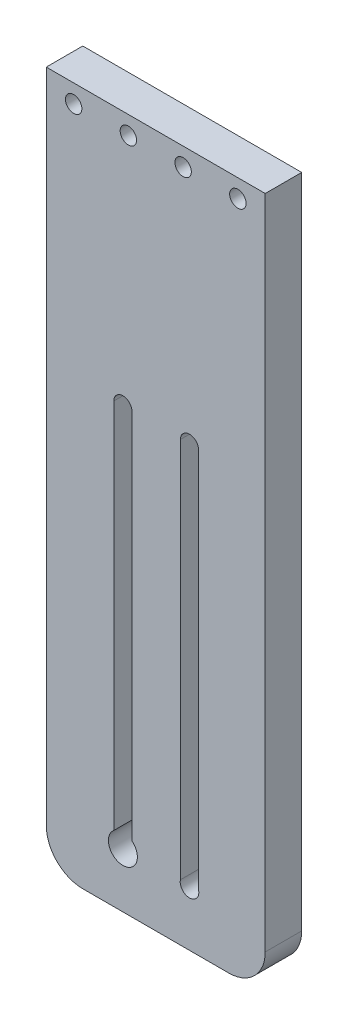
ISO-10303-21;
HEADER;
FILE_DESCRIPTION(('STEP AP214'),'2;1');
FILE_NAME('part.step','',(''),(''),'','','');
FILE_SCHEMA(('AUTOMOTIVE_DESIGN { 1 0 10303 214 1 1 1 1 }'));
ENDSEC;
DATA;
#1=APPLICATION_CONTEXT('core data for automotive mechanical design processes');
#2=APPLICATION_PROTOCOL_DEFINITION('international standard','automotive_design',2000,#1);
#3=PRODUCT_CONTEXT('',#1,'mechanical');
#4=PRODUCT('Part','Part','',(#3));
#5=PRODUCT_RELATED_PRODUCT_CATEGORY('part','',(#4));
#6=PRODUCT_DEFINITION_FORMATION('','',#4);
#7=PRODUCT_DEFINITION_CONTEXT('part definition',#1,'design');
#8=PRODUCT_DEFINITION('design','',#6,#7);
#9=PRODUCT_DEFINITION_SHAPE('','',#8);
#10=(LENGTH_UNIT() NAMED_UNIT(*) SI_UNIT(.MILLI.,.METRE.));
#11=(NAMED_UNIT(*) PLANE_ANGLE_UNIT() SI_UNIT($,.RADIAN.));
#12=(NAMED_UNIT(*) SI_UNIT($,.STERADIAN.) SOLID_ANGLE_UNIT());
#13=UNCERTAINTY_MEASURE_WITH_UNIT(LENGTH_MEASURE(1.E-05),#10,'distance_accuracy_value','');
#14=(GEOMETRIC_REPRESENTATION_CONTEXT(3) GLOBAL_UNCERTAINTY_ASSIGNED_CONTEXT((#13)) GLOBAL_UNIT_ASSIGNED_CONTEXT((#10,
#11,#12)) REPRESENTATION_CONTEXT('',''));
#15=CARTESIAN_POINT('',(0.,0.,0.));
#16=DIRECTION('',(0.,0.,1.));
#17=DIRECTION('',(1.,0.,0.));
#18=AXIS2_PLACEMENT_3D('',#15,#16,#17);
#19=CARTESIAN_POINT('',(0.,0.,10.));
#20=DIRECTION('',(0.,0.,1.));
#21=DIRECTION('',(1.,0.,0.));
#22=AXIS2_PLACEMENT_3D('',#19,#20,#21);
#23=PLANE('',#22);
#24=DIRECTION('',(0.,-1.,0.));
#25=VECTOR('',#24,1.);
#26=CARTESIAN_POINT('',(18.5,-175.,10.));
#27=LINE('',#26,#25);
#28=CARTESIAN_POINT('',(18.5,-70.,10.));
#29=VERTEX_POINT('',#28);
#30=CARTESIAN_POINT('',(18.5,-171.91763458323,10.));
#31=VERTEX_POINT('',#30);
#32=EDGE_CURVE('E235',#29,#31,#27,.T.);
#33=ORIENTED_EDGE('',*,*,#32,.F.);
#34=CARTESIAN_POINT('',(21.,-70.,10.));
#35=DIRECTION('',(0.,0.,1.));
#36=DIRECTION('',(1.,0.,0.));
#37=AXIS2_PLACEMENT_3D('',#34,#35,#36);
#38=CIRCLE('',#37,2.5);
#39=CARTESIAN_POINT('',(23.5,-70.,10.));
#40=VERTEX_POINT('',#39);
#41=EDGE_CURVE('E237',#40,#29,#38,.T.);
#42=ORIENTED_EDGE('',*,*,#41,.F.);
#43=DIRECTION('',(0.,1.,0.));
#44=VECTOR('',#43,1.);
#45=CARTESIAN_POINT('',(23.5,-175.,10.));
#46=LINE('',#45,#44);
#47=CARTESIAN_POINT('',(23.5,-171.91763458323,10.));
#48=VERTEX_POINT('',#47);
#49=EDGE_CURVE('E216',#48,#40,#46,.T.);
#50=ORIENTED_EDGE('',*,*,#49,.F.);
#51=CARTESIAN_POINT('',(21.,-175.,10.));
#52=DIRECTION('',(0.,0.,1.));
#53=DIRECTION('',(1.,0.,0.));
#54=AXIS2_PLACEMENT_3D('',#51,#52,#53);
#55=CIRCLE('',#54,3.96874999999999);
#56=EDGE_CURVE('E267',#31,#48,#55,.T.);
#57=ORIENTED_EDGE('',*,*,#56,.F.);
#58=EDGE_LOOP('',(#33,#42,#50,#57));
#59=FACE_BOUND('',#58,.T.);
#60=DIRECTION('',(0.,-1.,0.));
#61=VECTOR('',#60,1.);
#62=CARTESIAN_POINT('',(36.75,-175.,10.));
#63=LINE('',#62,#61);
#64=CARTESIAN_POINT('',(36.75,-70.,10.));
#65=VERTEX_POINT('',#64);
#66=CARTESIAN_POINT('',(36.75,-174.483979370567,10.));
#67=VERTEX_POINT('',#66);
#68=EDGE_CURVE('E253',#65,#67,#63,.T.);
#69=ORIENTED_EDGE('',*,*,#68,.F.);
#70=CARTESIAN_POINT('',(39.25,-70.,10.));
#71=DIRECTION('',(0.,0.,1.));
#72=DIRECTION('',(1.,0.,0.));
#73=AXIS2_PLACEMENT_3D('',#70,#71,#72);
#74=CIRCLE('',#73,2.5);
#75=CARTESIAN_POINT('',(41.75,-70.,10.));
#76=VERTEX_POINT('',#75);
#77=EDGE_CURVE('E261',#76,#65,#74,.T.);
#78=ORIENTED_EDGE('',*,*,#77,.F.);
#79=DIRECTION('',(0.,1.,0.));
#80=VECTOR('',#79,1.);
#81=CARTESIAN_POINT('',(41.75,-175.,10.));
#82=LINE('',#81,#80);
#83=CARTESIAN_POINT('',(41.75,-174.483979370567,10.));
#84=VERTEX_POINT('',#83);
#85=EDGE_CURVE('E247',#84,#76,#82,.T.);
#86=ORIENTED_EDGE('',*,*,#85,.F.);
#87=CARTESIAN_POINT('',(39.25,-175.,10.));
#88=DIRECTION('',(0.,0.,1.));
#89=DIRECTION('',(1.,0.,0.));
#90=AXIS2_PLACEMENT_3D('',#87,#88,#89);
#91=CIRCLE('',#90,2.55269999999998);
#92=EDGE_CURVE('E273',#67,#84,#91,.T.);
#93=ORIENTED_EDGE('',*,*,#92,.F.);
#94=EDGE_LOOP('',(#69,#78,#86,#93));
#95=FACE_BOUND('',#94,.T.);
#96=CARTESIAN_POINT('',(52.5,-5.,10.));
#97=DIRECTION('',(0.,0.,1.));
#98=DIRECTION('',(1.,0.,0.));
#99=AXIS2_PLACEMENT_3D('',#96,#97,#98);
#100=CIRCLE('',#99,2.25);
#101=CARTESIAN_POINT('',(54.75,-5.,10.));
#102=VERTEX_POINT('',#101);
#103=EDGE_CURVE('E284',#102,#102,#100,.F.);
#104=ORIENTED_EDGE('',*,*,#103,.T.);
#105=EDGE_LOOP('',(#104));
#106=FACE_BOUND('',#105,.T.);
#107=CARTESIAN_POINT('',(37.5,-5.,10.));
#108=DIRECTION('',(0.,0.,1.));
#109=DIRECTION('',(1.,0.,0.));
#110=AXIS2_PLACEMENT_3D('',#107,#108,#109);
#111=CIRCLE('',#110,2.25);
#112=CARTESIAN_POINT('',(39.75,-5.,10.));
#113=VERTEX_POINT('',#112);
#114=EDGE_CURVE('E296',#113,#113,#111,.F.);
#115=ORIENTED_EDGE('',*,*,#114,.T.);
#116=EDGE_LOOP('',(#115));
#117=FACE_BOUND('',#116,.T.);
#118=DIRECTION('',(0.,-1.,0.));
#119=VECTOR('',#118,1.);
#120=CARTESIAN_POINT('',(0.,0.,10.));
#121=LINE('',#120,#119);
#122=CARTESIAN_POINT('',(0.,0.,10.));
#123=VERTEX_POINT('',#122);
#124=CARTESIAN_POINT('',(0.,-180.,10.));
#125=VERTEX_POINT('',#124);
#126=EDGE_CURVE('E328',#123,#125,#121,.T.);
#127=ORIENTED_EDGE('',*,*,#126,.T.);
#128=CARTESIAN_POINT('',(10.,-180.,10.));
#129=DIRECTION('',(0.,0.,1.));
#130=DIRECTION('',(1.,0.,0.));
#131=AXIS2_PLACEMENT_3D('',#128,#129,#130);
#132=CIRCLE('',#131,10.);
#133=CARTESIAN_POINT('',(10.,-190.,10.));
#134=VERTEX_POINT('',#133);
#135=EDGE_CURVE('E377',#125,#134,#132,.T.);
#136=ORIENTED_EDGE('',*,*,#135,.T.);
#137=DIRECTION('',(1.,0.,0.));
#138=VECTOR('',#137,1.);
#139=CARTESIAN_POINT('',(0.,-190.,10.));
#140=LINE('',#139,#138);
#141=CARTESIAN_POINT('',(50.,-190.,10.));
#142=VERTEX_POINT('',#141);
#143=EDGE_CURVE('E331',#134,#142,#140,.T.);
#144=ORIENTED_EDGE('',*,*,#143,.T.);
#145=CARTESIAN_POINT('',(50.,-180.,10.));
#146=DIRECTION('',(0.,0.,1.));
#147=DIRECTION('',(1.,0.,0.));
#148=AXIS2_PLACEMENT_3D('',#145,#146,#147);
#149=CIRCLE('',#148,10.);
#150=CARTESIAN_POINT('',(60.,-180.,10.));
#151=VERTEX_POINT('',#150);
#152=EDGE_CURVE('E375',#142,#151,#149,.T.);
#153=ORIENTED_EDGE('',*,*,#152,.T.);
#154=DIRECTION('',(0.,1.,0.));
#155=VECTOR('',#154,1.);
#156=CARTESIAN_POINT('',(60.,-150.,10.));
#157=LINE('',#156,#155);
#158=CARTESIAN_POINT('',(60.,0.,10.));
#159=VERTEX_POINT('',#158);
#160=EDGE_CURVE('E335',#151,#159,#157,.T.);
#161=ORIENTED_EDGE('',*,*,#160,.T.);
#162=DIRECTION('',(-1.,0.,0.));
#163=VECTOR('',#162,1.);
#164=CARTESIAN_POINT('',(0.,0.,10.));
#165=LINE('',#164,#163);
#166=EDGE_CURVE('E337',#159,#123,#165,.T.);
#167=ORIENTED_EDGE('',*,*,#166,.T.);
#168=EDGE_LOOP('',(#127,#136,#144,#153,#161,#167));
#169=FACE_BOUND('',#168,.T.);
#170=CARTESIAN_POINT('',(7.5,-5.,10.));
#171=DIRECTION('',(0.,0.,1.));
#172=DIRECTION('',(1.,0.,0.));
#173=AXIS2_PLACEMENT_3D('',#170,#171,#172);
#174=CIRCLE('',#173,2.25);
#175=CARTESIAN_POINT('',(9.75,-5.,10.));
#176=VERTEX_POINT('',#175);
#177=EDGE_CURVE('E320',#176,#176,#174,.F.);
#178=ORIENTED_EDGE('',*,*,#177,.T.);
#179=EDGE_LOOP('',(#178));
#180=FACE_BOUND('',#179,.T.);
#181=CARTESIAN_POINT('',(22.5,-5.,10.));
#182=DIRECTION('',(0.,0.,1.));
#183=DIRECTION('',(1.,0.,0.));
#184=AXIS2_PLACEMENT_3D('',#181,#182,#183);
#185=CIRCLE('',#184,2.25);
#186=CARTESIAN_POINT('',(24.75,-5.,10.));
#187=VERTEX_POINT('',#186);
#188=EDGE_CURVE('E308',#187,#187,#185,.F.);
#189=ORIENTED_EDGE('',*,*,#188,.T.);
#190=EDGE_LOOP('',(#189));
#191=FACE_BOUND('',#190,.T.);
#192=ADVANCED_FACE('F37',(#59,#95,#106,#117,#169,#180,#191),#23,.T.);
#193=CARTESIAN_POINT('',(0.,0.,10.));
#194=DIRECTION('',(1.,0.,0.));
#195=DIRECTION('',(0.,1.,0.));
#196=AXIS2_PLACEMENT_3D('',#193,#194,#195);
#197=PLANE('',#196);
#198=DIRECTION('',(0.,-1.,0.));
#199=VECTOR('',#198,1.);
#200=CARTESIAN_POINT('',(0.,0.,0.));
#201=LINE('',#200,#199);
#202=CARTESIAN_POINT('',(0.,0.,0.));
#203=VERTEX_POINT('',#202);
#204=CARTESIAN_POINT('',(0.,-180.,0.));
#205=VERTEX_POINT('',#204);
#206=EDGE_CURVE('E323',#203,#205,#201,.T.);
#207=ORIENTED_EDGE('',*,*,#206,.T.);
#208=DIRECTION('',(0.,0.,-1.));
#209=VECTOR('',#208,1.);
#210=CARTESIAN_POINT('',(0.,-180.,10.));
#211=LINE('',#210,#209);
#212=EDGE_CURVE('E373',#205,#125,#211,.F.);
#213=ORIENTED_EDGE('',*,*,#212,.T.);
#214=ORIENTED_EDGE('',*,*,#126,.F.);
#215=DIRECTION('',(0.,0.,-1.));
#216=VECTOR('',#215,1.);
#217=CARTESIAN_POINT('',(0.,0.,10.));
#218=LINE('',#217,#216);
#219=EDGE_CURVE('E339',#123,#203,#218,.T.);
#220=ORIENTED_EDGE('',*,*,#219,.T.);
#221=EDGE_LOOP('',(#207,#213,#214,#220));
#222=FACE_BOUND('',#221,.T.);
#223=ADVANCED_FACE('F526',(#222),#197,.F.);
#224=CARTESIAN_POINT('',(0.,-190.,10.));
#225=DIRECTION('',(0.,1.,0.));
#226=DIRECTION('',(0.,0.,1.));
#227=AXIS2_PLACEMENT_3D('',#224,#225,#226);
#228=PLANE('',#227);
#229=ORIENTED_EDGE('',*,*,#143,.F.);
#230=DIRECTION('',(0.,0.,-1.));
#231=VECTOR('',#230,1.);
#232=CARTESIAN_POINT('',(10.,-190.,10.));
#233=LINE('',#232,#231);
#234=CARTESIAN_POINT('',(10.,-190.,0.));
#235=VERTEX_POINT('',#234);
#236=EDGE_CURVE('E366',#134,#235,#233,.T.);
#237=ORIENTED_EDGE('',*,*,#236,.T.);
#238=DIRECTION('',(1.,0.,0.));
#239=VECTOR('',#238,1.);
#240=CARTESIAN_POINT('',(0.,-190.,0.));
#241=LINE('',#240,#239);
#242=CARTESIAN_POINT('',(50.,-190.,0.));
#243=VERTEX_POINT('',#242);
#244=EDGE_CURVE('E342',#235,#243,#241,.T.);
#245=ORIENTED_EDGE('',*,*,#244,.T.);
#246=DIRECTION('',(0.,0.,-1.));
#247=VECTOR('',#246,1.);
#248=CARTESIAN_POINT('',(50.,-190.,10.));
#249=LINE('',#248,#247);
#250=EDGE_CURVE('E364',#243,#142,#249,.F.);
#251=ORIENTED_EDGE('',*,*,#250,.T.);
#252=EDGE_LOOP('',(#229,#237,#245,#251));
#253=FACE_BOUND('',#252,.T.);
#254=ADVANCED_FACE('F531',(#253),#228,.F.);
#255=CARTESIAN_POINT('',(60.,0.,10.));
#256=DIRECTION('',(-1.,0.,0.));
#257=DIRECTION('',(0.,-1.,0.));
#258=AXIS2_PLACEMENT_3D('',#255,#256,#257);
#259=PLANE('',#258);
#260=ORIENTED_EDGE('',*,*,#160,.F.);
#261=DIRECTION('',(0.,0.,-1.));
#262=VECTOR('',#261,1.);
#263=CARTESIAN_POINT('',(60.,-180.,10.));
#264=LINE('',#263,#262);
#265=CARTESIAN_POINT('',(60.,-180.,0.));
#266=VERTEX_POINT('',#265);
#267=EDGE_CURVE('E379',#151,#266,#264,.T.);
#268=ORIENTED_EDGE('',*,*,#267,.T.);
#269=DIRECTION('',(0.,1.,0.));
#270=VECTOR('',#269,1.);
#271=CARTESIAN_POINT('',(60.,0.,0.));
#272=LINE('',#271,#270);
#273=CARTESIAN_POINT('',(60.,0.,0.));
#274=VERTEX_POINT('',#273);
#275=EDGE_CURVE('E345',#266,#274,#272,.T.);
#276=ORIENTED_EDGE('',*,*,#275,.T.);
#277=DIRECTION('',(0.,0.,-1.));
#278=VECTOR('',#277,1.);
#279=CARTESIAN_POINT('',(60.,0.,10.));
#280=LINE('',#279,#278);
#281=EDGE_CURVE('E350',#159,#274,#280,.T.);
#282=ORIENTED_EDGE('',*,*,#281,.F.);
#283=EDGE_LOOP('',(#260,#268,#276,#282));
#284=FACE_BOUND('',#283,.T.);
#285=ADVANCED_FACE('F521',(#284),#259,.F.);
#286=CARTESIAN_POINT('',(0.,0.,10.));
#287=DIRECTION('',(0.,-1.,0.));
#288=DIRECTION('',(0.,0.,-1.));
#289=AXIS2_PLACEMENT_3D('',#286,#287,#288);
#290=PLANE('',#289);
#291=DIRECTION('',(-1.,0.,0.));
#292=VECTOR('',#291,1.);
#293=CARTESIAN_POINT('',(0.,0.,0.));
#294=LINE('',#293,#292);
#295=EDGE_CURVE('E332',#274,#203,#294,.T.);
#296=ORIENTED_EDGE('',*,*,#295,.T.);
#297=ORIENTED_EDGE('',*,*,#219,.F.);
#298=ORIENTED_EDGE('',*,*,#166,.F.);
#299=ORIENTED_EDGE('',*,*,#281,.T.);
#300=EDGE_LOOP('',(#296,#297,#298,#299));
#301=FACE_BOUND('',#300,.T.);
#302=ADVANCED_FACE('F512',(#301),#290,.F.);
#303=CARTESIAN_POINT('',(0.,0.,0.));
#304=DIRECTION('',(0.,0.,1.));
#305=DIRECTION('',(1.,0.,0.));
#306=AXIS2_PLACEMENT_3D('',#303,#304,#305);
#307=PLANE('',#306);
#308=DIRECTION('',(0.,1.,0.));
#309=VECTOR('',#308,1.);
#310=CARTESIAN_POINT('',(19.9,-15.,0.));
#311=LINE('',#310,#309);
#312=CARTESIAN_POINT('',(19.9,-50.5278640450004,0.));
#313=VERTEX_POINT('',#312);
#314=CARTESIAN_POINT('',(19.9,-19.,0.));
#315=VERTEX_POINT('',#314);
#316=EDGE_CURVE('E452',#313,#315,#311,.T.);
#317=ORIENTED_EDGE('',*,*,#316,.F.);
#318=CARTESIAN_POINT('',(15.9,-50.5278640450004,0.));
#319=DIRECTION('',(0.,0.,1.));
#320=DIRECTION('',(1.,0.,0.));
#321=AXIS2_PLACEMENT_3D('',#318,#319,#320);
#322=CIRCLE('',#321,4.);
#323=CARTESIAN_POINT('',(18.5666666666667,-53.5092880150001,0.));
#324=VERTEX_POINT('',#323);
#325=EDGE_CURVE('E407',#313,#324,#322,.F.);
#326=ORIENTED_EDGE('',*,*,#325,.T.);
#327=CARTESIAN_POINT('',(19.9,-55.,0.));
#328=DIRECTION('',(0.,0.,-1.));
#329=DIRECTION('',(-1.,0.,0.));
#330=AXIS2_PLACEMENT_3D('',#327,#328,#329);
#331=CIRCLE('',#330,2.);
#332=CARTESIAN_POINT('',(21.3907119849999,-56.3333333333333,0.));
#333=VERTEX_POINT('',#332);
#334=EDGE_CURVE('E455',#333,#324,#331,.T.);
#335=ORIENTED_EDGE('',*,*,#334,.F.);
#336=CARTESIAN_POINT('',(24.3721359549996,-59.,0.));
#337=DIRECTION('',(0.,0.,1.));
#338=DIRECTION('',(1.,0.,0.));
#339=AXIS2_PLACEMENT_3D('',#336,#337,#338);
#340=CIRCLE('',#339,4.);
#341=CARTESIAN_POINT('',(24.3721359549996,-55.,0.));
#342=VERTEX_POINT('',#341);
#343=EDGE_CURVE('E402',#333,#342,#340,.F.);
#344=ORIENTED_EDGE('',*,*,#343,.T.);
#345=DIRECTION('',(-1.,0.,0.));
#346=VECTOR('',#345,1.);
#347=CARTESIAN_POINT('',(40.1,-55.,0.));
#348=LINE('',#347,#346);
#349=CARTESIAN_POINT('',(35.6278640450004,-55.,0.));
#350=VERTEX_POINT('',#349);
#351=EDGE_CURVE('E240',#350,#342,#348,.T.);
#352=ORIENTED_EDGE('',*,*,#351,.F.);
#353=CARTESIAN_POINT('',(35.6278640450004,-59.,0.));
#354=DIRECTION('',(0.,0.,1.));
#355=DIRECTION('',(1.,0.,0.));
#356=AXIS2_PLACEMENT_3D('',#353,#354,#355);
#357=CIRCLE('',#356,4.);
#358=CARTESIAN_POINT('',(38.6092880150001,-56.3333333333333,0.));
#359=VERTEX_POINT('',#358);
#360=EDGE_CURVE('E52',#350,#359,#357,.F.);
#361=ORIENTED_EDGE('',*,*,#360,.T.);
#362=CARTESIAN_POINT('',(40.1,-55.,0.));
#363=DIRECTION('',(0.,0.,-1.));
#364=DIRECTION('',(-1.,0.,0.));
#365=AXIS2_PLACEMENT_3D('',#362,#363,#364);
#366=CIRCLE('',#365,2.);
#367=CARTESIAN_POINT('',(41.4333333333333,-53.5092880150001,0.));
#368=VERTEX_POINT('',#367);
#369=EDGE_CURVE('E448',#368,#359,#366,.T.);
#370=ORIENTED_EDGE('',*,*,#369,.F.);
#371=CARTESIAN_POINT('',(44.1,-50.5278640450004,0.));
#372=DIRECTION('',(0.,0.,1.));
#373=DIRECTION('',(1.,0.,0.));
#374=AXIS2_PLACEMENT_3D('',#371,#372,#373);
#375=CIRCLE('',#374,4.);
#376=CARTESIAN_POINT('',(40.1,-50.5278640450004,0.));
#377=VERTEX_POINT('',#376);
#378=EDGE_CURVE('E405',#368,#377,#375,.F.);
#379=ORIENTED_EDGE('',*,*,#378,.T.);
#380=DIRECTION('',(0.,-1.,0.));
#381=VECTOR('',#380,1.);
#382=CARTESIAN_POINT('',(40.1,-15.,0.));
#383=LINE('',#382,#381);
#384=CARTESIAN_POINT('',(40.1,-19.,0.));
#385=VERTEX_POINT('',#384);
#386=EDGE_CURVE('E470',#385,#377,#383,.T.);
#387=ORIENTED_EDGE('',*,*,#386,.F.);
#388=CARTESIAN_POINT('',(36.1,-19.,0.));
#389=DIRECTION('',(0.,0.,1.));
#390=DIRECTION('',(1.,0.,0.));
#391=AXIS2_PLACEMENT_3D('',#388,#389,#390);
#392=CIRCLE('',#391,4.);
#393=CARTESIAN_POINT('',(36.1,-15.,0.));
#394=VERTEX_POINT('',#393);
#395=EDGE_CURVE('E424',#385,#394,#392,.T.);
#396=ORIENTED_EDGE('',*,*,#395,.T.);
#397=DIRECTION('',(1.,0.,0.));
#398=VECTOR('',#397,1.);
#399=CARTESIAN_POINT('',(40.1,-15.,0.));
#400=LINE('',#399,#398);
#401=CARTESIAN_POINT('',(23.9,-15.,0.));
#402=VERTEX_POINT('',#401);
#403=EDGE_CURVE('E468',#402,#394,#400,.T.);
#404=ORIENTED_EDGE('',*,*,#403,.F.);
#405=CARTESIAN_POINT('',(23.9,-19.,0.));
#406=DIRECTION('',(0.,0.,1.));
#407=DIRECTION('',(1.,0.,0.));
#408=AXIS2_PLACEMENT_3D('',#405,#406,#407);
#409=CIRCLE('',#408,4.);
#410=EDGE_CURVE('E422',#402,#315,#409,.T.);
#411=ORIENTED_EDGE('',*,*,#410,.T.);
#412=EDGE_LOOP('',(#317,#326,#335,#344,#352,#361,#370,#379,#387,#396,#404,#411));
#413=FACE_BOUND('',#412,.T.);
#414=CARTESIAN_POINT('',(21.,-70.,0.));
#415=DIRECTION('',(0.,0.,1.));
#416=DIRECTION('',(1.,0.,0.));
#417=AXIS2_PLACEMENT_3D('',#414,#415,#416);
#418=CIRCLE('',#417,2.5);
#419=CARTESIAN_POINT('',(23.5,-70.,0.));
#420=VERTEX_POINT('',#419);
#421=CARTESIAN_POINT('',(18.5,-70.,0.));
#422=VERTEX_POINT('',#421);
#423=EDGE_CURVE('E224',#420,#422,#418,.T.);
#424=ORIENTED_EDGE('',*,*,#423,.T.);
#425=DIRECTION('',(0.,-1.,0.));
#426=VECTOR('',#425,1.);
#427=CARTESIAN_POINT('',(18.5,-175.,0.));
#428=LINE('',#427,#426);
#429=CARTESIAN_POINT('',(18.5,-171.91763458323,0.));
#430=VERTEX_POINT('',#429);
#431=EDGE_CURVE('E221',#422,#430,#428,.T.);
#432=ORIENTED_EDGE('',*,*,#431,.T.);
#433=CARTESIAN_POINT('',(21.,-175.,0.));
#434=DIRECTION('',(0.,0.,1.));
#435=DIRECTION('',(1.,0.,0.));
#436=AXIS2_PLACEMENT_3D('',#433,#434,#435);
#437=CIRCLE('',#436,3.96874999999999);
#438=CARTESIAN_POINT('',(23.5,-171.91763458323,0.));
#439=VERTEX_POINT('',#438);
#440=EDGE_CURVE('E234',#430,#439,#437,.T.);
#441=ORIENTED_EDGE('',*,*,#440,.T.);
#442=DIRECTION('',(0.,1.,0.));
#443=VECTOR('',#442,1.);
#444=CARTESIAN_POINT('',(23.5,-175.,0.));
#445=LINE('',#444,#443);
#446=EDGE_CURVE('E213',#439,#420,#445,.T.);
#447=ORIENTED_EDGE('',*,*,#446,.T.);
#448=EDGE_LOOP('',(#424,#432,#441,#447));
#449=FACE_BOUND('',#448,.T.);
#450=CARTESIAN_POINT('',(39.25,-70.,0.));
#451=DIRECTION('',(0.,0.,1.));
#452=DIRECTION('',(1.,0.,0.));
#453=AXIS2_PLACEMENT_3D('',#450,#451,#452);
#454=CIRCLE('',#453,2.5);
#455=CARTESIAN_POINT('',(41.75,-70.,0.));
#456=VERTEX_POINT('',#455);
#457=CARTESIAN_POINT('',(36.75,-70.,0.));
#458=VERTEX_POINT('',#457);
#459=EDGE_CURVE('E252',#456,#458,#454,.T.);
#460=ORIENTED_EDGE('',*,*,#459,.T.);
#461=DIRECTION('',(0.,-1.,0.));
#462=VECTOR('',#461,1.);
#463=CARTESIAN_POINT('',(36.75,-175.,0.));
#464=LINE('',#463,#462);
#465=CARTESIAN_POINT('',(36.75,-174.483979370567,0.));
#466=VERTEX_POINT('',#465);
#467=EDGE_CURVE('E256',#458,#466,#464,.T.);
#468=ORIENTED_EDGE('',*,*,#467,.T.);
#469=CARTESIAN_POINT('',(39.25,-175.,0.));
#470=DIRECTION('',(0.,0.,1.));
#471=DIRECTION('',(1.,0.,0.));
#472=AXIS2_PLACEMENT_3D('',#469,#470,#471);
#473=CIRCLE('',#472,2.5527);
#474=CARTESIAN_POINT('',(41.75,-174.483979370567,0.));
#475=VERTEX_POINT('',#474);
#476=EDGE_CURVE('E276',#466,#475,#473,.T.);
#477=ORIENTED_EDGE('',*,*,#476,.T.);
#478=DIRECTION('',(0.,1.,0.));
#479=VECTOR('',#478,1.);
#480=CARTESIAN_POINT('',(41.75,-175.,0.));
#481=LINE('',#480,#479);
#482=EDGE_CURVE('E249',#475,#456,#481,.T.);
#483=ORIENTED_EDGE('',*,*,#482,.T.);
#484=EDGE_LOOP('',(#460,#468,#477,#483));
#485=FACE_BOUND('',#484,.T.);
#486=CARTESIAN_POINT('',(52.5,-5.,0.));
#487=DIRECTION('',(0.,0.,-1.));
#488=DIRECTION('',(-1.,0.,0.));
#489=AXIS2_PLACEMENT_3D('',#486,#487,#488);
#490=CIRCLE('',#489,4.);
#491=CARTESIAN_POINT('',(48.5,-5.,0.));
#492=VERTEX_POINT('',#491);
#493=EDGE_CURVE('E279',#492,#492,#490,.T.);
#494=ORIENTED_EDGE('',*,*,#493,.F.);
#495=EDGE_LOOP('',(#494));
#496=FACE_BOUND('',#495,.T.);
#497=CARTESIAN_POINT('',(37.5,-5.,0.));
#498=DIRECTION('',(0.,0.,-1.));
#499=DIRECTION('',(-1.,0.,0.));
#500=AXIS2_PLACEMENT_3D('',#497,#498,#499);
#501=CIRCLE('',#500,4.);
#502=CARTESIAN_POINT('',(33.5,-5.,0.));
#503=VERTEX_POINT('',#502);
#504=EDGE_CURVE('E287',#503,#503,#501,.T.);
#505=ORIENTED_EDGE('',*,*,#504,.F.);
#506=EDGE_LOOP('',(#505));
#507=FACE_BOUND('',#506,.T.);
#508=CARTESIAN_POINT('',(22.5,-5.,0.));
#509=DIRECTION('',(0.,0.,-1.));
#510=DIRECTION('',(-1.,0.,0.));
#511=AXIS2_PLACEMENT_3D('',#508,#509,#510);
#512=CIRCLE('',#511,4.);
#513=CARTESIAN_POINT('',(18.5,-5.,0.));
#514=VERTEX_POINT('',#513);
#515=EDGE_CURVE('E299',#514,#514,#512,.T.);
#516=ORIENTED_EDGE('',*,*,#515,.F.);
#517=EDGE_LOOP('',(#516));
#518=FACE_BOUND('',#517,.T.);
#519=CARTESIAN_POINT('',(7.5,-5.,0.));
#520=DIRECTION('',(0.,0.,-1.));
#521=DIRECTION('',(-1.,0.,0.));
#522=AXIS2_PLACEMENT_3D('',#519,#520,#521);
#523=CIRCLE('',#522,4.);
#524=CARTESIAN_POINT('',(3.5,-5.,0.));
#525=VERTEX_POINT('',#524);
#526=EDGE_CURVE('E311',#525,#525,#523,.T.);
#527=ORIENTED_EDGE('',*,*,#526,.F.);
#528=EDGE_LOOP('',(#527));
#529=FACE_BOUND('',#528,.T.);
#530=ORIENTED_EDGE('',*,*,#244,.F.);
#531=CARTESIAN_POINT('',(10.,-180.,0.));
#532=DIRECTION('',(0.,0.,1.));
#533=DIRECTION('',(1.,0.,0.));
#534=AXIS2_PLACEMENT_3D('',#531,#532,#533);
#535=CIRCLE('',#534,10.);
#536=EDGE_CURVE('E371',#235,#205,#535,.F.);
#537=ORIENTED_EDGE('',*,*,#536,.T.);
#538=ORIENTED_EDGE('',*,*,#206,.F.);
#539=ORIENTED_EDGE('',*,*,#295,.F.);
#540=ORIENTED_EDGE('',*,*,#275,.F.);
#541=CARTESIAN_POINT('',(50.,-180.,0.));
#542=DIRECTION('',(0.,0.,1.));
#543=DIRECTION('',(1.,0.,0.));
#544=AXIS2_PLACEMENT_3D('',#541,#542,#543);
#545=CIRCLE('',#544,10.);
#546=EDGE_CURVE('E369',#266,#243,#545,.F.);
#547=ORIENTED_EDGE('',*,*,#546,.T.);
#548=EDGE_LOOP('',(#530,#537,#538,#539,#540,#547));
#549=FACE_BOUND('',#548,.T.);
#550=ADVANCED_FACE('F231',(#413,#449,#485,#496,#507,#518,#529,#549),#307,.F.);
#551=CARTESIAN_POINT('',(7.5,-5.,0.));
#552=DIRECTION('',(0.,0.,-1.));
#553=DIRECTION('',(-1.,0.,0.));
#554=AXIS2_PLACEMENT_3D('',#551,#552,#553);
#555=CYLINDRICAL_SURFACE('',#554,2.25);
#556=ORIENTED_EDGE('',*,*,#177,.F.);
#557=EDGE_LOOP('',(#556));
#558=FACE_BOUND('',#557,.T.);
#559=CARTESIAN_POINT('',(7.5,-5.,4.));
#560=DIRECTION('',(0.,0.,-1.));
#561=DIRECTION('',(-1.,0.,0.));
#562=AXIS2_PLACEMENT_3D('',#559,#560,#561);
#563=CIRCLE('',#562,2.25);
#564=CARTESIAN_POINT('',(5.25,-5.,4.));
#565=VERTEX_POINT('',#564);
#566=EDGE_CURVE('E316',#565,#565,#563,.T.);
#567=ORIENTED_EDGE('',*,*,#566,.T.);
#568=EDGE_LOOP('',(#567));
#569=FACE_BOUND('',#568,.T.);
#570=ADVANCED_FACE('F511',(#558,#569),#555,.F.);
#571=CARTESIAN_POINT('',(9.75,-5.,4.));
#572=DIRECTION('',(0.,0.,1.));
#573=DIRECTION('',(1.,0.,0.));
#574=AXIS2_PLACEMENT_3D('',#571,#572,#573);
#575=PLANE('',#574);
#576=ORIENTED_EDGE('',*,*,#566,.F.);
#577=EDGE_LOOP('',(#576));
#578=FACE_BOUND('',#577,.T.);
#579=CARTESIAN_POINT('',(7.5,-5.,4.));
#580=DIRECTION('',(0.,0.,-1.));
#581=DIRECTION('',(-1.,0.,0.));
#582=AXIS2_PLACEMENT_3D('',#579,#580,#581);
#583=CIRCLE('',#582,4.);
#584=CARTESIAN_POINT('',(3.5,-5.,4.));
#585=VERTEX_POINT('',#584);
#586=EDGE_CURVE('E319',#585,#585,#583,.T.);
#587=ORIENTED_EDGE('',*,*,#586,.T.);
#588=EDGE_LOOP('',(#587));
#589=FACE_BOUND('',#588,.T.);
#590=ADVANCED_FACE('F518',(#578,#589),#575,.F.);
#591=CARTESIAN_POINT('',(7.5,-5.,0.));
#592=DIRECTION('',(0.,0.,-1.));
#593=DIRECTION('',(-1.,0.,0.));
#594=AXIS2_PLACEMENT_3D('',#591,#592,#593);
#595=CYLINDRICAL_SURFACE('',#594,4.);
#596=ORIENTED_EDGE('',*,*,#586,.F.);
#597=EDGE_LOOP('',(#596));
#598=FACE_BOUND('',#597,.T.);
#599=ORIENTED_EDGE('',*,*,#526,.T.);
#600=EDGE_LOOP('',(#599));
#601=FACE_BOUND('',#600,.T.);
#602=ADVANCED_FACE('F537',(#598,#601),#595,.F.);
#603=CARTESIAN_POINT('',(22.5,-5.,0.));
#604=DIRECTION('',(0.,0.,-1.));
#605=DIRECTION('',(-1.,0.,0.));
#606=AXIS2_PLACEMENT_3D('',#603,#604,#605);
#607=CYLINDRICAL_SURFACE('',#606,2.25);
#608=ORIENTED_EDGE('',*,*,#188,.F.);
#609=EDGE_LOOP('',(#608));
#610=FACE_BOUND('',#609,.T.);
#611=CARTESIAN_POINT('',(22.5,-5.,4.));
#612=DIRECTION('',(0.,0.,-1.));
#613=DIRECTION('',(-1.,0.,0.));
#614=AXIS2_PLACEMENT_3D('',#611,#612,#613);
#615=CIRCLE('',#614,2.25);
#616=CARTESIAN_POINT('',(20.25,-5.,4.));
#617=VERTEX_POINT('',#616);
#618=EDGE_CURVE('E304',#617,#617,#615,.T.);
#619=ORIENTED_EDGE('',*,*,#618,.T.);
#620=EDGE_LOOP('',(#619));
#621=FACE_BOUND('',#620,.T.);
#622=ADVANCED_FACE('F540',(#610,#621),#607,.F.);
#623=CARTESIAN_POINT('',(24.75,-5.,4.));
#624=DIRECTION('',(0.,0.,1.));
#625=DIRECTION('',(1.,0.,0.));
#626=AXIS2_PLACEMENT_3D('',#623,#624,#625);
#627=PLANE('',#626);
#628=ORIENTED_EDGE('',*,*,#618,.F.);
#629=EDGE_LOOP('',(#628));
#630=FACE_BOUND('',#629,.T.);
#631=CARTESIAN_POINT('',(22.5,-5.,4.));
#632=DIRECTION('',(0.,0.,-1.));
#633=DIRECTION('',(-1.,0.,0.));
#634=AXIS2_PLACEMENT_3D('',#631,#632,#633);
#635=CIRCLE('',#634,4.);
#636=CARTESIAN_POINT('',(18.5,-5.,4.));
#637=VERTEX_POINT('',#636);
#638=EDGE_CURVE('E307',#637,#637,#635,.T.);
#639=ORIENTED_EDGE('',*,*,#638,.T.);
#640=EDGE_LOOP('',(#639));
#641=FACE_BOUND('',#640,.T.);
#642=ADVANCED_FACE('F549',(#630,#641),#627,.F.);
#643=CARTESIAN_POINT('',(22.5,-5.,0.));
#644=DIRECTION('',(0.,0.,-1.));
#645=DIRECTION('',(-1.,0.,0.));
#646=AXIS2_PLACEMENT_3D('',#643,#644,#645);
#647=CYLINDRICAL_SURFACE('',#646,4.);
#648=ORIENTED_EDGE('',*,*,#638,.F.);
#649=EDGE_LOOP('',(#648));
#650=FACE_BOUND('',#649,.T.);
#651=ORIENTED_EDGE('',*,*,#515,.T.);
#652=EDGE_LOOP('',(#651));
#653=FACE_BOUND('',#652,.T.);
#654=ADVANCED_FACE('F545',(#650,#653),#647,.F.);
#655=CARTESIAN_POINT('',(37.5,-5.,0.));
#656=DIRECTION('',(0.,0.,-1.));
#657=DIRECTION('',(-1.,0.,0.));
#658=AXIS2_PLACEMENT_3D('',#655,#656,#657);
#659=CYLINDRICAL_SURFACE('',#658,2.25);
#660=ORIENTED_EDGE('',*,*,#114,.F.);
#661=EDGE_LOOP('',(#660));
#662=FACE_BOUND('',#661,.T.);
#663=CARTESIAN_POINT('',(37.5,-5.,4.));
#664=DIRECTION('',(0.,0.,-1.));
#665=DIRECTION('',(-1.,0.,0.));
#666=AXIS2_PLACEMENT_3D('',#663,#664,#665);
#667=CIRCLE('',#666,2.25);
#668=CARTESIAN_POINT('',(35.25,-5.,4.));
#669=VERTEX_POINT('',#668);
#670=EDGE_CURVE('E292',#669,#669,#667,.T.);
#671=ORIENTED_EDGE('',*,*,#670,.T.);
#672=EDGE_LOOP('',(#671));
#673=FACE_BOUND('',#672,.T.);
#674=ADVANCED_FACE('F548',(#662,#673),#659,.F.);
#675=CARTESIAN_POINT('',(39.75,-5.,4.));
#676=DIRECTION('',(0.,0.,1.));
#677=DIRECTION('',(1.,0.,0.));
#678=AXIS2_PLACEMENT_3D('',#675,#676,#677);
#679=PLANE('',#678);
#680=ORIENTED_EDGE('',*,*,#670,.F.);
#681=EDGE_LOOP('',(#680));
#682=FACE_BOUND('',#681,.T.);
#683=CARTESIAN_POINT('',(37.5,-5.,4.));
#684=DIRECTION('',(0.,0.,-1.));
#685=DIRECTION('',(-1.,0.,0.));
#686=AXIS2_PLACEMENT_3D('',#683,#684,#685);
#687=CIRCLE('',#686,4.);
#688=CARTESIAN_POINT('',(33.5,-5.,4.));
#689=VERTEX_POINT('',#688);
#690=EDGE_CURVE('E295',#689,#689,#687,.T.);
#691=ORIENTED_EDGE('',*,*,#690,.T.);
#692=EDGE_LOOP('',(#691));
#693=FACE_BOUND('',#692,.T.);
#694=ADVANCED_FACE('F561',(#682,#693),#679,.F.);
#695=CARTESIAN_POINT('',(37.5,-5.,0.));
#696=DIRECTION('',(0.,0.,-1.));
#697=DIRECTION('',(-1.,0.,0.));
#698=AXIS2_PLACEMENT_3D('',#695,#696,#697);
#699=CYLINDRICAL_SURFACE('',#698,4.);
#700=ORIENTED_EDGE('',*,*,#690,.F.);
#701=EDGE_LOOP('',(#700));
#702=FACE_BOUND('',#701,.T.);
#703=ORIENTED_EDGE('',*,*,#504,.T.);
#704=EDGE_LOOP('',(#703));
#705=FACE_BOUND('',#704,.T.);
#706=ADVANCED_FACE('F557',(#702,#705),#699,.F.);
#707=CARTESIAN_POINT('',(52.5,-5.,0.));
#708=DIRECTION('',(0.,0.,-1.));
#709=DIRECTION('',(-1.,0.,0.));
#710=AXIS2_PLACEMENT_3D('',#707,#708,#709);
#711=CYLINDRICAL_SURFACE('',#710,2.25);
#712=ORIENTED_EDGE('',*,*,#103,.F.);
#713=EDGE_LOOP('',(#712));
#714=FACE_BOUND('',#713,.T.);
#715=CARTESIAN_POINT('',(52.5,-5.,4.));
#716=DIRECTION('',(0.,0.,-1.));
#717=DIRECTION('',(-1.,0.,0.));
#718=AXIS2_PLACEMENT_3D('',#715,#716,#717);
#719=CIRCLE('',#718,2.25);
#720=CARTESIAN_POINT('',(50.25,-5.,4.));
#721=VERTEX_POINT('',#720);
#722=EDGE_CURVE('E280',#721,#721,#719,.T.);
#723=ORIENTED_EDGE('',*,*,#722,.T.);
#724=EDGE_LOOP('',(#723));
#725=FACE_BOUND('',#724,.T.);
#726=ADVANCED_FACE('F560',(#714,#725),#711,.F.);
#727=CARTESIAN_POINT('',(54.75,-5.,4.));
#728=DIRECTION('',(0.,0.,1.));
#729=DIRECTION('',(1.,0.,0.));
#730=AXIS2_PLACEMENT_3D('',#727,#728,#729);
#731=PLANE('',#730);
#732=ORIENTED_EDGE('',*,*,#722,.F.);
#733=EDGE_LOOP('',(#732));
#734=FACE_BOUND('',#733,.T.);
#735=CARTESIAN_POINT('',(52.5,-5.,4.));
#736=DIRECTION('',(0.,0.,-1.));
#737=DIRECTION('',(-1.,0.,0.));
#738=AXIS2_PLACEMENT_3D('',#735,#736,#737);
#739=CIRCLE('',#738,4.);
#740=CARTESIAN_POINT('',(48.5,-5.,4.));
#741=VERTEX_POINT('',#740);
#742=EDGE_CURVE('E283',#741,#741,#739,.T.);
#743=ORIENTED_EDGE('',*,*,#742,.T.);
#744=EDGE_LOOP('',(#743));
#745=FACE_BOUND('',#744,.T.);
#746=ADVANCED_FACE('F573',(#734,#745),#731,.F.);
#747=CARTESIAN_POINT('',(52.5,-5.,0.));
#748=DIRECTION('',(0.,0.,-1.));
#749=DIRECTION('',(-1.,0.,0.));
#750=AXIS2_PLACEMENT_3D('',#747,#748,#749);
#751=CYLINDRICAL_SURFACE('',#750,4.);
#752=ORIENTED_EDGE('',*,*,#742,.F.);
#753=EDGE_LOOP('',(#752));
#754=FACE_BOUND('',#753,.T.);
#755=ORIENTED_EDGE('',*,*,#493,.T.);
#756=EDGE_LOOP('',(#755));
#757=FACE_BOUND('',#756,.T.);
#758=ADVANCED_FACE('F569',(#754,#757),#751,.F.);
#759=CARTESIAN_POINT('',(39.25,-175.,10.));
#760=DIRECTION('',(0.,0.,1.));
#761=DIRECTION('',(1.,0.,0.));
#762=AXIS2_PLACEMENT_3D('',#759,#760,#761);
#763=CYLINDRICAL_SURFACE('',#762,2.55269999999999);
#764=ORIENTED_EDGE('',*,*,#476,.F.);
#765=DIRECTION('',(0.,0.,1.));
#766=VECTOR('',#765,1.);
#767=CARTESIAN_POINT('',(36.75,-174.483979370567,10.));
#768=LINE('',#767,#766);
#769=EDGE_CURVE('E356',#466,#67,#768,.T.);
#770=ORIENTED_EDGE('',*,*,#769,.T.);
#771=ORIENTED_EDGE('',*,*,#92,.T.);
#772=DIRECTION('',(0.,0.,1.));
#773=VECTOR('',#772,1.);
#774=CARTESIAN_POINT('',(41.75,-174.483979370567,10.));
#775=LINE('',#774,#773);
#776=EDGE_CURVE('E353',#84,#475,#775,.F.);
#777=ORIENTED_EDGE('',*,*,#776,.T.);
#778=EDGE_LOOP('',(#764,#770,#771,#777));
#779=FACE_BOUND('',#778,.T.);
#780=ADVANCED_FACE('F572',(#779),#763,.F.);
#781=CARTESIAN_POINT('',(21.,-175.,10.));
#782=DIRECTION('',(0.,0.,1.));
#783=DIRECTION('',(1.,0.,0.));
#784=AXIS2_PLACEMENT_3D('',#781,#782,#783);
#785=CYLINDRICAL_SURFACE('',#784,3.96874999999999);
#786=ORIENTED_EDGE('',*,*,#440,.F.);
#787=DIRECTION('',(0.,0.,1.));
#788=VECTOR('',#787,1.);
#789=CARTESIAN_POINT('',(18.5,-171.91763458323,10.));
#790=LINE('',#789,#788);
#791=EDGE_CURVE('E361',#430,#31,#790,.T.);
#792=ORIENTED_EDGE('',*,*,#791,.T.);
#793=ORIENTED_EDGE('',*,*,#56,.T.);
#794=DIRECTION('',(0.,0.,1.));
#795=VECTOR('',#794,1.);
#796=CARTESIAN_POINT('',(23.5,-171.91763458323,10.));
#797=LINE('',#796,#795);
#798=EDGE_CURVE('E359',#48,#439,#797,.F.);
#799=ORIENTED_EDGE('',*,*,#798,.T.);
#800=EDGE_LOOP('',(#786,#792,#793,#799));
#801=FACE_BOUND('',#800,.T.);
#802=ADVANCED_FACE('F583',(#801),#785,.F.);
#803=CARTESIAN_POINT('',(36.75,-175.,0.));
#804=DIRECTION('',(-1.,0.,0.));
#805=DIRECTION('',(0.,0.,1.));
#806=AXIS2_PLACEMENT_3D('',#803,#804,#805);
#807=PLANE('',#806);
#808=ORIENTED_EDGE('',*,*,#467,.F.);
#809=DIRECTION('',(0.,0.,1.));
#810=VECTOR('',#809,1.);
#811=CARTESIAN_POINT('',(36.75,-70.,0.));
#812=LINE('',#811,#810);
#813=EDGE_CURVE('E265',#458,#65,#812,.T.);
#814=ORIENTED_EDGE('',*,*,#813,.T.);
#815=ORIENTED_EDGE('',*,*,#68,.T.);
#816=ORIENTED_EDGE('',*,*,#769,.F.);
#817=EDGE_LOOP('',(#808,#814,#815,#816));
#818=FACE_BOUND('',#817,.T.);
#819=ADVANCED_FACE('F587',(#818),#807,.F.);
#820=CARTESIAN_POINT('',(41.75,-175.,0.));
#821=DIRECTION('',(1.,0.,0.));
#822=DIRECTION('',(0.,0.,-1.));
#823=AXIS2_PLACEMENT_3D('',#820,#821,#822);
#824=PLANE('',#823);
#825=ORIENTED_EDGE('',*,*,#85,.T.);
#826=DIRECTION('',(0.,0.,1.));
#827=VECTOR('',#826,1.);
#828=CARTESIAN_POINT('',(41.75,-70.,0.));
#829=LINE('',#828,#827);
#830=EDGE_CURVE('E259',#456,#76,#829,.T.);
#831=ORIENTED_EDGE('',*,*,#830,.F.);
#832=ORIENTED_EDGE('',*,*,#482,.F.);
#833=ORIENTED_EDGE('',*,*,#776,.F.);
#834=EDGE_LOOP('',(#825,#831,#832,#833));
#835=FACE_BOUND('',#834,.T.);
#836=ADVANCED_FACE('F589',(#835),#824,.F.);
#837=CARTESIAN_POINT('',(39.25,-70.,0.));
#838=DIRECTION('',(0.,0.,1.));
#839=DIRECTION('',(1.,0.,0.));
#840=AXIS2_PLACEMENT_3D('',#837,#838,#839);
#841=CYLINDRICAL_SURFACE('',#840,2.5);
#842=ORIENTED_EDGE('',*,*,#77,.T.);
#843=ORIENTED_EDGE('',*,*,#813,.F.);
#844=ORIENTED_EDGE('',*,*,#459,.F.);
#845=ORIENTED_EDGE('',*,*,#830,.T.);
#846=EDGE_LOOP('',(#842,#843,#844,#845));
#847=FACE_BOUND('',#846,.T.);
#848=ADVANCED_FACE('F592',(#847),#841,.F.);
#849=CARTESIAN_POINT('',(18.5,-175.,0.));
#850=DIRECTION('',(-1.,0.,0.));
#851=DIRECTION('',(0.,0.,1.));
#852=AXIS2_PLACEMENT_3D('',#849,#850,#851);
#853=PLANE('',#852);
#854=ORIENTED_EDGE('',*,*,#431,.F.);
#855=DIRECTION('',(0.,0.,1.));
#856=VECTOR('',#855,1.);
#857=CARTESIAN_POINT('',(18.5,-70.,0.));
#858=LINE('',#857,#856);
#859=EDGE_CURVE('E220',#422,#29,#858,.T.);
#860=ORIENTED_EDGE('',*,*,#859,.T.);
#861=ORIENTED_EDGE('',*,*,#32,.T.);
#862=ORIENTED_EDGE('',*,*,#791,.F.);
#863=EDGE_LOOP('',(#854,#860,#861,#862));
#864=FACE_BOUND('',#863,.T.);
#865=ADVANCED_FACE('F596',(#864),#853,.F.);
#866=CARTESIAN_POINT('',(23.5,-175.,0.));
#867=DIRECTION('',(1.,0.,0.));
#868=DIRECTION('',(0.,0.,-1.));
#869=AXIS2_PLACEMENT_3D('',#866,#867,#868);
#870=PLANE('',#869);
#871=ORIENTED_EDGE('',*,*,#49,.T.);
#872=DIRECTION('',(0.,0.,1.));
#873=VECTOR('',#872,1.);
#874=CARTESIAN_POINT('',(23.5,-70.,0.));
#875=LINE('',#874,#873);
#876=EDGE_CURVE('E209',#420,#40,#875,.T.);
#877=ORIENTED_EDGE('',*,*,#876,.F.);
#878=ORIENTED_EDGE('',*,*,#446,.F.);
#879=ORIENTED_EDGE('',*,*,#798,.F.);
#880=EDGE_LOOP('',(#871,#877,#878,#879));
#881=FACE_BOUND('',#880,.T.);
#882=ADVANCED_FACE('F211',(#881),#870,.F.);
#883=CARTESIAN_POINT('',(21.,-70.,0.));
#884=DIRECTION('',(0.,0.,1.));
#885=DIRECTION('',(1.,0.,0.));
#886=AXIS2_PLACEMENT_3D('',#883,#884,#885);
#887=CYLINDRICAL_SURFACE('',#886,2.5);
#888=ORIENTED_EDGE('',*,*,#41,.T.);
#889=ORIENTED_EDGE('',*,*,#859,.F.);
#890=ORIENTED_EDGE('',*,*,#423,.F.);
#891=ORIENTED_EDGE('',*,*,#876,.T.);
#892=EDGE_LOOP('',(#888,#889,#890,#891));
#893=FACE_BOUND('',#892,.T.);
#894=ADVANCED_FACE('F225',(#893),#887,.F.);
#895=CARTESIAN_POINT('',(10.,-180.,10.));
#896=DIRECTION('',(0.,0.,-1.));
#897=DIRECTION('',(-1.,0.,0.));
#898=AXIS2_PLACEMENT_3D('',#895,#896,#897);
#899=CYLINDRICAL_SURFACE('',#898,10.);
#900=ORIENTED_EDGE('',*,*,#135,.F.);
#901=ORIENTED_EDGE('',*,*,#212,.F.);
#902=ORIENTED_EDGE('',*,*,#536,.F.);
#903=ORIENTED_EDGE('',*,*,#236,.F.);
#904=EDGE_LOOP('',(#900,#901,#902,#903));
#905=FACE_BOUND('',#904,.T.);
#906=ADVANCED_FACE('F605',(#905),#899,.T.);
#907=CARTESIAN_POINT('',(50.,-180.,10.));
#908=DIRECTION('',(0.,0.,-1.));
#909=DIRECTION('',(-1.,0.,0.));
#910=AXIS2_PLACEMENT_3D('',#907,#908,#909);
#911=CYLINDRICAL_SURFACE('',#910,10.);
#912=ORIENTED_EDGE('',*,*,#152,.F.);
#913=ORIENTED_EDGE('',*,*,#250,.F.);
#914=ORIENTED_EDGE('',*,*,#546,.F.);
#915=ORIENTED_EDGE('',*,*,#267,.F.);
#916=EDGE_LOOP('',(#912,#913,#914,#915));
#917=FACE_BOUND('',#916,.T.);
#918=ADVANCED_FACE('F611',(#917),#911,.T.);
#919=CARTESIAN_POINT('',(19.9,-15.,7.));
#920=DIRECTION('',(-1.,0.,0.));
#921=DIRECTION('',(0.,0.,1.));
#922=AXIS2_PLACEMENT_3D('',#919,#920,#921);
#923=PLANE('',#922);
#924=ORIENTED_EDGE('',*,*,#316,.T.);
#925=DIRECTION('',(0.,0.,-1.));
#926=VECTOR('',#925,1.);
#927=CARTESIAN_POINT('',(19.9,-19.,7.));
#928=LINE('',#927,#926);
#929=CARTESIAN_POINT('',(19.9,-19.,7.));
#930=VERTEX_POINT('',#929);
#931=EDGE_CURVE('E390',#315,#930,#928,.F.);
#932=ORIENTED_EDGE('',*,*,#931,.T.);
#933=DIRECTION('',(0.,1.,0.));
#934=VECTOR('',#933,1.);
#935=CARTESIAN_POINT('',(19.9,-15.,7.));
#936=LINE('',#935,#934);
#937=CARTESIAN_POINT('',(19.9,-50.5278640450004,7.));
#938=VERTEX_POINT('',#937);
#939=EDGE_CURVE('E459',#938,#930,#936,.T.);
#940=ORIENTED_EDGE('',*,*,#939,.F.);
#941=DIRECTION('',(0.,0.,-1.));
#942=VECTOR('',#941,1.);
#943=CARTESIAN_POINT('',(19.9,-50.5278640450004,7.));
#944=LINE('',#943,#942);
#945=EDGE_CURVE('E387',#938,#313,#944,.T.);
#946=ORIENTED_EDGE('',*,*,#945,.T.);
#947=EDGE_LOOP('',(#924,#932,#940,#946));
#948=FACE_BOUND('',#947,.T.);
#949=ADVANCED_FACE('F491',(#948),#923,.F.);
#950=CARTESIAN_POINT('',(40.1,-55.,7.));
#951=DIRECTION('',(0.,-1.,0.));
#952=DIRECTION('',(0.,0.,-1.));
#953=AXIS2_PLACEMENT_3D('',#950,#951,#952);
#954=PLANE('',#953);
#955=DIRECTION('',(-1.,0.,0.));
#956=VECTOR('',#955,1.);
#957=CARTESIAN_POINT('',(40.1,-55.,7.));
#958=LINE('',#957,#956);
#959=CARTESIAN_POINT('',(35.6278640450004,-55.,7.));
#960=VERTEX_POINT('',#959);
#961=CARTESIAN_POINT('',(24.3721359549996,-55.,7.));
#962=VERTEX_POINT('',#961);
#963=EDGE_CURVE('E245',#960,#962,#958,.T.);
#964=ORIENTED_EDGE('',*,*,#963,.F.);
#965=DIRECTION('',(0.,0.,-1.));
#966=VECTOR('',#965,1.);
#967=CARTESIAN_POINT('',(35.6278640450004,-55.,7.));
#968=LINE('',#967,#966);
#969=EDGE_CURVE('E419',#960,#350,#968,.T.);
#970=ORIENTED_EDGE('',*,*,#969,.T.);
#971=ORIENTED_EDGE('',*,*,#351,.T.);
#972=DIRECTION('',(0.,0.,-1.));
#973=VECTOR('',#972,1.);
#974=CARTESIAN_POINT('',(24.3721359549996,-55.,7.));
#975=LINE('',#974,#973);
#976=EDGE_CURVE('E416',#342,#962,#975,.F.);
#977=ORIENTED_EDGE('',*,*,#976,.T.);
#978=EDGE_LOOP('',(#964,#970,#971,#977));
#979=FACE_BOUND('',#978,.T.);
#980=ADVANCED_FACE('F441',(#979),#954,.F.);
#981=CARTESIAN_POINT('',(40.1,-15.,7.));
#982=DIRECTION('',(1.,0.,0.));
#983=DIRECTION('',(0.,1.,0.));
#984=AXIS2_PLACEMENT_3D('',#981,#982,#983);
#985=PLANE('',#984);
#986=DIRECTION('',(0.,-1.,0.));
#987=VECTOR('',#986,1.);
#988=CARTESIAN_POINT('',(40.1,-15.,7.));
#989=LINE('',#988,#987);
#990=CARTESIAN_POINT('',(40.1,-19.,7.));
#991=VERTEX_POINT('',#990);
#992=CARTESIAN_POINT('',(40.1,-50.5278640450004,7.));
#993=VERTEX_POINT('',#992);
#994=EDGE_CURVE('E444',#991,#993,#989,.T.);
#995=ORIENTED_EDGE('',*,*,#994,.F.);
#996=DIRECTION('',(0.,0.,-1.));
#997=VECTOR('',#996,1.);
#998=CARTESIAN_POINT('',(40.1,-19.,0.));
#999=LINE('',#998,#997);
#1000=EDGE_CURVE('E399',#991,#385,#999,.T.);
#1001=ORIENTED_EDGE('',*,*,#1000,.T.);
#1002=ORIENTED_EDGE('',*,*,#386,.T.);
#1003=DIRECTION('',(0.,0.,-1.));
#1004=VECTOR('',#1003,1.);
#1005=CARTESIAN_POINT('',(40.1,-50.5278640450004,7.));
#1006=LINE('',#1005,#1004);
#1007=EDGE_CURVE('E396',#377,#993,#1006,.F.);
#1008=ORIENTED_EDGE('',*,*,#1007,.T.);
#1009=EDGE_LOOP('',(#995,#1001,#1002,#1008));
#1010=FACE_BOUND('',#1009,.T.);
#1011=ADVANCED_FACE('F507',(#1010),#985,.F.);
#1012=CARTESIAN_POINT('',(40.1,-15.,7.));
#1013=DIRECTION('',(0.,1.,0.));
#1014=DIRECTION('',(0.,0.,1.));
#1015=AXIS2_PLACEMENT_3D('',#1012,#1013,#1014);
#1016=PLANE('',#1015);
#1017=DIRECTION('',(1.,0.,0.));
#1018=VECTOR('',#1017,1.);
#1019=CARTESIAN_POINT('',(40.1,-15.,7.));
#1020=LINE('',#1019,#1018);
#1021=CARTESIAN_POINT('',(23.9,-15.,7.));
#1022=VERTEX_POINT('',#1021);
#1023=CARTESIAN_POINT('',(36.1,-15.,7.));
#1024=VERTEX_POINT('',#1023);
#1025=EDGE_CURVE('E461',#1022,#1024,#1020,.T.);
#1026=ORIENTED_EDGE('',*,*,#1025,.F.);
#1027=DIRECTION('',(0.,0.,-1.));
#1028=VECTOR('',#1027,1.);
#1029=CARTESIAN_POINT('',(23.9,-15.,0.));
#1030=LINE('',#1029,#1028);
#1031=EDGE_CURVE('E384',#1022,#402,#1030,.T.);
#1032=ORIENTED_EDGE('',*,*,#1031,.T.);
#1033=ORIENTED_EDGE('',*,*,#403,.T.);
#1034=DIRECTION('',(0.,0.,-1.));
#1035=VECTOR('',#1034,1.);
#1036=CARTESIAN_POINT('',(36.1,-15.,7.));
#1037=LINE('',#1036,#1035);
#1038=EDGE_CURVE('E382',#394,#1024,#1037,.F.);
#1039=ORIENTED_EDGE('',*,*,#1038,.T.);
#1040=EDGE_LOOP('',(#1026,#1032,#1033,#1039));
#1041=FACE_BOUND('',#1040,.T.);
#1042=ADVANCED_FACE('F500',(#1041),#1016,.F.);
#1043=CARTESIAN_POINT('',(0.,0.,7.));
#1044=DIRECTION('',(0.,0.,-1.));
#1045=DIRECTION('',(-1.,0.,0.));
#1046=AXIS2_PLACEMENT_3D('',#1043,#1044,#1045);
#1047=PLANE('',#1046);
#1048=ORIENTED_EDGE('',*,*,#939,.T.);
#1049=CARTESIAN_POINT('',(23.9,-19.,7.));
#1050=DIRECTION('',(0.,0.,-1.));
#1051=DIRECTION('',(-1.,0.,0.));
#1052=AXIS2_PLACEMENT_3D('',#1049,#1050,#1051);
#1053=CIRCLE('',#1052,4.);
#1054=EDGE_CURVE('E394',#930,#1022,#1053,.T.);
#1055=ORIENTED_EDGE('',*,*,#1054,.T.);
#1056=ORIENTED_EDGE('',*,*,#1025,.T.);
#1057=CARTESIAN_POINT('',(36.1,-19.,7.));
#1058=DIRECTION('',(0.,0.,-1.));
#1059=DIRECTION('',(-1.,0.,0.));
#1060=AXIS2_PLACEMENT_3D('',#1057,#1058,#1059);
#1061=CIRCLE('',#1060,4.);
#1062=EDGE_CURVE('E392',#1024,#991,#1061,.T.);
#1063=ORIENTED_EDGE('',*,*,#1062,.T.);
#1064=ORIENTED_EDGE('',*,*,#994,.T.);
#1065=CARTESIAN_POINT('',(44.1,-50.5278640450004,7.));
#1066=DIRECTION('',(0.,0.,-1.));
#1067=DIRECTION('',(-1.,0.,0.));
#1068=AXIS2_PLACEMENT_3D('',#1065,#1066,#1067);
#1069=CIRCLE('',#1068,4.);
#1070=CARTESIAN_POINT('',(41.4333333333333,-53.5092880150001,7.));
#1071=VERTEX_POINT('',#1070);
#1072=EDGE_CURVE('E428',#993,#1071,#1069,.F.);
#1073=ORIENTED_EDGE('',*,*,#1072,.T.);
#1074=CARTESIAN_POINT('',(40.1,-55.,7.));
#1075=DIRECTION('',(0.,0.,-1.));
#1076=DIRECTION('',(-1.,0.,0.));
#1077=AXIS2_PLACEMENT_3D('',#1074,#1075,#1076);
#1078=CIRCLE('',#1077,2.);
#1079=CARTESIAN_POINT('',(38.6092880150001,-56.3333333333333,7.));
#1080=VERTEX_POINT('',#1079);
#1081=EDGE_CURVE('E436',#1071,#1080,#1078,.T.);
#1082=ORIENTED_EDGE('',*,*,#1081,.T.);
#1083=CARTESIAN_POINT('',(35.6278640450004,-59.,7.));
#1084=DIRECTION('',(0.,0.,-1.));
#1085=DIRECTION('',(-1.,0.,0.));
#1086=AXIS2_PLACEMENT_3D('',#1083,#1084,#1085);
#1087=CIRCLE('',#1086,4.);
#1088=EDGE_CURVE('E45',#1080,#960,#1087,.F.);
#1089=ORIENTED_EDGE('',*,*,#1088,.T.);
#1090=ORIENTED_EDGE('',*,*,#963,.T.);
#1091=CARTESIAN_POINT('',(24.3721359549996,-59.,7.));
#1092=DIRECTION('',(0.,0.,-1.));
#1093=DIRECTION('',(-1.,0.,0.));
#1094=AXIS2_PLACEMENT_3D('',#1091,#1092,#1093);
#1095=CIRCLE('',#1094,4.);
#1096=CARTESIAN_POINT('',(21.3907119849999,-56.3333333333333,7.));
#1097=VERTEX_POINT('',#1096);
#1098=EDGE_CURVE('E11',#962,#1097,#1095,.F.);
#1099=ORIENTED_EDGE('',*,*,#1098,.T.);
#1100=CARTESIAN_POINT('',(19.9,-55.,7.));
#1101=DIRECTION('',(0.,0.,-1.));
#1102=DIRECTION('',(-1.,0.,0.));
#1103=AXIS2_PLACEMENT_3D('',#1100,#1101,#1102);
#1104=CIRCLE('',#1103,2.);
#1105=CARTESIAN_POINT('',(18.5666666666667,-53.5092880150001,7.));
#1106=VERTEX_POINT('',#1105);
#1107=EDGE_CURVE('E450',#1097,#1106,#1104,.T.);
#1108=ORIENTED_EDGE('',*,*,#1107,.T.);
#1109=CARTESIAN_POINT('',(15.9,-50.5278640450004,7.));
#1110=DIRECTION('',(0.,0.,-1.));
#1111=DIRECTION('',(-1.,0.,0.));
#1112=AXIS2_PLACEMENT_3D('',#1109,#1110,#1111);
#1113=CIRCLE('',#1112,4.);
#1114=EDGE_CURVE('E426',#1106,#938,#1113,.F.);
#1115=ORIENTED_EDGE('',*,*,#1114,.T.);
#1116=EDGE_LOOP('',(#1048,#1055,#1056,#1063,#1064,#1073,#1082,#1089,#1090,#1099,#1108,#1115));
#1117=FACE_BOUND('',#1116,.T.);
#1118=ADVANCED_FACE('F435',(#1117),#1047,.T.);
#1119=CARTESIAN_POINT('',(40.1,-55.,7.));
#1120=DIRECTION('',(0.,0.,-1.));
#1121=DIRECTION('',(-1.,0.,0.));
#1122=AXIS2_PLACEMENT_3D('',#1119,#1120,#1121);
#1123=CYLINDRICAL_SURFACE('',#1122,2.);
#1124=ORIENTED_EDGE('',*,*,#1081,.F.);
#1125=DIRECTION('',(0.,0.,-1.));
#1126=VECTOR('',#1125,1.);
#1127=CARTESIAN_POINT('',(41.4333333333333,-53.5092880150001,7.));
#1128=LINE('',#1127,#1126);
#1129=EDGE_CURVE('E59',#1071,#368,#1128,.T.);
#1130=ORIENTED_EDGE('',*,*,#1129,.T.);
#1131=ORIENTED_EDGE('',*,*,#369,.T.);
#1132=DIRECTION('',(0.,0.,-1.));
#1133=VECTOR('',#1132,1.);
#1134=CARTESIAN_POINT('',(38.6092880150001,-56.3333333333333,7.));
#1135=LINE('',#1134,#1133);
#1136=EDGE_CURVE('E413',#359,#1080,#1135,.F.);
#1137=ORIENTED_EDGE('',*,*,#1136,.T.);
#1138=EDGE_LOOP('',(#1124,#1130,#1131,#1137));
#1139=FACE_BOUND('',#1138,.T.);
#1140=ADVANCED_FACE('F447',(#1139),#1123,.F.);
#1141=CARTESIAN_POINT('',(19.9,-55.,7.));
#1142=DIRECTION('',(0.,0.,-1.));
#1143=DIRECTION('',(-1.,0.,0.));
#1144=AXIS2_PLACEMENT_3D('',#1141,#1142,#1143);
#1145=CYLINDRICAL_SURFACE('',#1144,2.);
#1146=ORIENTED_EDGE('',*,*,#334,.T.);
#1147=DIRECTION('',(0.,0.,-1.));
#1148=VECTOR('',#1147,1.);
#1149=CARTESIAN_POINT('',(18.5666666666667,-53.5092880150001,7.));
#1150=LINE('',#1149,#1148);
#1151=EDGE_CURVE('E411',#324,#1106,#1150,.F.);
#1152=ORIENTED_EDGE('',*,*,#1151,.T.);
#1153=ORIENTED_EDGE('',*,*,#1107,.F.);
#1154=DIRECTION('',(0.,0.,-1.));
#1155=VECTOR('',#1154,1.);
#1156=CARTESIAN_POINT('',(21.3907119849999,-56.3333333333333,7.));
#1157=LINE('',#1156,#1155);
#1158=EDGE_CURVE('E409',#1097,#333,#1157,.T.);
#1159=ORIENTED_EDGE('',*,*,#1158,.T.);
#1160=EDGE_LOOP('',(#1146,#1152,#1153,#1159));
#1161=FACE_BOUND('',#1160,.T.);
#1162=ADVANCED_FACE('F482',(#1161),#1145,.F.);
#1163=CARTESIAN_POINT('',(23.9,-19.,7.));
#1164=DIRECTION('',(0.,0.,1.));
#1165=DIRECTION('',(1.,0.,0.));
#1166=AXIS2_PLACEMENT_3D('',#1163,#1164,#1165);
#1167=CYLINDRICAL_SURFACE('',#1166,4.);
#1168=ORIENTED_EDGE('',*,*,#1054,.F.);
#1169=ORIENTED_EDGE('',*,*,#931,.F.);
#1170=ORIENTED_EDGE('',*,*,#410,.F.);
#1171=ORIENTED_EDGE('',*,*,#1031,.F.);
#1172=EDGE_LOOP('',(#1168,#1169,#1170,#1171));
#1173=FACE_BOUND('',#1172,.T.);
#1174=ADVANCED_FACE('F495',(#1173),#1167,.F.);
#1175=CARTESIAN_POINT('',(36.1,-19.,7.));
#1176=DIRECTION('',(0.,0.,1.));
#1177=DIRECTION('',(1.,0.,0.));
#1178=AXIS2_PLACEMENT_3D('',#1175,#1176,#1177);
#1179=CYLINDRICAL_SURFACE('',#1178,4.);
#1180=ORIENTED_EDGE('',*,*,#1062,.F.);
#1181=ORIENTED_EDGE('',*,*,#1038,.F.);
#1182=ORIENTED_EDGE('',*,*,#395,.F.);
#1183=ORIENTED_EDGE('',*,*,#1000,.F.);
#1184=EDGE_LOOP('',(#1180,#1181,#1182,#1183));
#1185=FACE_BOUND('',#1184,.T.);
#1186=ADVANCED_FACE('F504',(#1185),#1179,.F.);
#1187=CARTESIAN_POINT('',(15.9,-50.5278640450004,7.));
#1188=DIRECTION('',(0.,0.,-1.));
#1189=DIRECTION('',(-1.,0.,0.));
#1190=AXIS2_PLACEMENT_3D('',#1187,#1188,#1189);
#1191=CYLINDRICAL_SURFACE('',#1190,4.);
#1192=ORIENTED_EDGE('',*,*,#1114,.F.);
#1193=ORIENTED_EDGE('',*,*,#1151,.F.);
#1194=ORIENTED_EDGE('',*,*,#325,.F.);
#1195=ORIENTED_EDGE('',*,*,#945,.F.);
#1196=EDGE_LOOP('',(#1192,#1193,#1194,#1195));
#1197=FACE_BOUND('',#1196,.T.);
#1198=ADVANCED_FACE('F486',(#1197),#1191,.T.);
#1199=CARTESIAN_POINT('',(44.1,-50.5278640450004,7.));
#1200=DIRECTION('',(0.,0.,-1.));
#1201=DIRECTION('',(-1.,0.,0.));
#1202=AXIS2_PLACEMENT_3D('',#1199,#1200,#1201);
#1203=CYLINDRICAL_SURFACE('',#1202,4.);
#1204=ORIENTED_EDGE('',*,*,#378,.F.);
#1205=ORIENTED_EDGE('',*,*,#1129,.F.);
#1206=ORIENTED_EDGE('',*,*,#1072,.F.);
#1207=ORIENTED_EDGE('',*,*,#1007,.F.);
#1208=EDGE_LOOP('',(#1204,#1205,#1206,#1207));
#1209=FACE_BOUND('',#1208,.T.);
#1210=ADVANCED_FACE('F509',(#1209),#1203,.T.);
#1211=CARTESIAN_POINT('',(35.6278640450004,-59.,7.));
#1212=DIRECTION('',(0.,0.,-1.));
#1213=DIRECTION('',(-1.,0.,0.));
#1214=AXIS2_PLACEMENT_3D('',#1211,#1212,#1213);
#1215=CYLINDRICAL_SURFACE('',#1214,4.);
#1216=ORIENTED_EDGE('',*,*,#1088,.F.);
#1217=ORIENTED_EDGE('',*,*,#1136,.F.);
#1218=ORIENTED_EDGE('',*,*,#360,.F.);
#1219=ORIENTED_EDGE('',*,*,#969,.F.);
#1220=EDGE_LOOP('',(#1216,#1217,#1218,#1219));
#1221=FACE_BOUND('',#1220,.T.);
#1222=ADVANCED_FACE('F446',(#1221),#1215,.T.);
#1223=CARTESIAN_POINT('',(24.3721359549996,-59.,7.));
#1224=DIRECTION('',(0.,0.,-1.));
#1225=DIRECTION('',(-1.,0.,0.));
#1226=AXIS2_PLACEMENT_3D('',#1223,#1224,#1225);
#1227=CYLINDRICAL_SURFACE('',#1226,4.);
#1228=ORIENTED_EDGE('',*,*,#343,.F.);
#1229=ORIENTED_EDGE('',*,*,#1158,.F.);
#1230=ORIENTED_EDGE('',*,*,#1098,.F.);
#1231=ORIENTED_EDGE('',*,*,#976,.F.);
#1232=EDGE_LOOP('',(#1228,#1229,#1230,#1231));
#1233=FACE_BOUND('',#1232,.T.);
#1234=ADVANCED_FACE('F39',(#1233),#1227,.T.);
#1235=CLOSED_SHELL('',(#192,#223,#254,#285,#302,#550,#570,#590,#602,#622,#642,#654,#674,#694,
#706,#726,#746,#758,#780,#802,#819,#836,#848,#865,#882,#894,#906,#918,#949,#980,#1011,#1042,
#1118,#1140,#1162,#1174,#1186,#1198,#1210,#1222,#1234));
#1236=MANIFOLD_SOLID_BREP('B2',#1235);
#1237=ADVANCED_BREP_SHAPE_REPRESENTATION('',(#18,#1236),#14);
#1238=SHAPE_DEFINITION_REPRESENTATION(#9,#1237);
ENDSEC;
END-ISO-10303-21;
